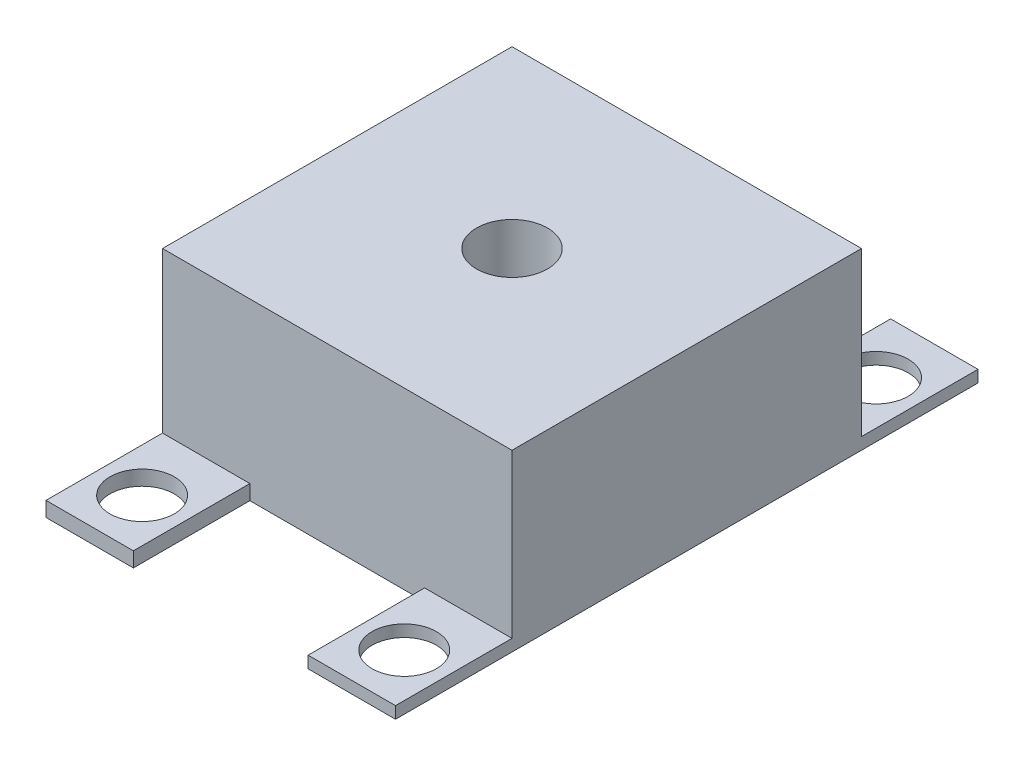
ISO-10303-21;
HEADER;
FILE_DESCRIPTION(('STEP AP214'),'2;1');
FILE_NAME('part.step','',(''),(''),'','','');
FILE_SCHEMA(('AUTOMOTIVE_DESIGN { 1 0 10303 214 1 1 1 1 }'));
ENDSEC;
DATA;
#1=APPLICATION_CONTEXT('core data for automotive mechanical design processes');
#2=APPLICATION_PROTOCOL_DEFINITION('international standard','automotive_design',2000,#1);
#3=PRODUCT_CONTEXT('',#1,'mechanical');
#4=PRODUCT('Part','Part','',(#3));
#5=PRODUCT_RELATED_PRODUCT_CATEGORY('part','',(#4));
#6=PRODUCT_DEFINITION_FORMATION('','',#4);
#7=PRODUCT_DEFINITION_CONTEXT('part definition',#1,'design');
#8=PRODUCT_DEFINITION('design','',#6,#7);
#9=PRODUCT_DEFINITION_SHAPE('','',#8);
#10=(LENGTH_UNIT() NAMED_UNIT(*) SI_UNIT(.MILLI.,.METRE.));
#11=(NAMED_UNIT(*) PLANE_ANGLE_UNIT() SI_UNIT($,.RADIAN.));
#12=(NAMED_UNIT(*) SI_UNIT($,.STERADIAN.) SOLID_ANGLE_UNIT());
#13=UNCERTAINTY_MEASURE_WITH_UNIT(LENGTH_MEASURE(1.E-05),#10,'distance_accuracy_value','');
#14=(GEOMETRIC_REPRESENTATION_CONTEXT(3) GLOBAL_UNCERTAINTY_ASSIGNED_CONTEXT((#13)) GLOBAL_UNIT_ASSIGNED_CONTEXT((#10,
#11,#12)) REPRESENTATION_CONTEXT('',''));
#15=CARTESIAN_POINT('',(0.,0.,0.));
#16=DIRECTION('',(0.,0.,1.));
#17=DIRECTION('',(1.,0.,0.));
#18=AXIS2_PLACEMENT_3D('',#15,#16,#17);
#19=CARTESIAN_POINT('',(15.,40.,-15.));
#20=DIRECTION('',(-1.,0.,0.));
#21=DIRECTION('',(0.,0.,1.));
#22=AXIS2_PLACEMENT_3D('',#19,#20,#21);
#23=PLANE('',#22);
#24=DIRECTION('',(0.,-1.,0.));
#25=VECTOR('',#24,1.);
#26=CARTESIAN_POINT('',(15.,40.,15.));
#27=LINE('',#26,#25);
#28=CARTESIAN_POINT('',(15.,40.,15.));
#29=VERTEX_POINT('',#28);
#30=CARTESIAN_POINT('',(15.,26.0178431332996,15.));
#31=VERTEX_POINT('',#30);
#32=EDGE_CURVE('E258',#29,#31,#27,.T.);
#33=ORIENTED_EDGE('',*,*,#32,.T.);
#34=DIRECTION('',(0.,0.,-1.));
#35=VECTOR('',#34,1.);
#36=CARTESIAN_POINT('',(15.,26.0178431332996,25.));
#37=LINE('',#36,#35);
#38=CARTESIAN_POINT('',(15.,26.0178431332996,25.));
#39=VERTEX_POINT('',#38);
#40=EDGE_CURVE('E226',#39,#31,#37,.T.);
#41=ORIENTED_EDGE('',*,*,#40,.F.);
#42=DIRECTION('',(0.,-1.,0.));
#43=VECTOR('',#42,1.);
#44=CARTESIAN_POINT('',(15.,25.,25.));
#45=LINE('',#44,#43);
#46=CARTESIAN_POINT('',(15.,25.,25.));
#47=VERTEX_POINT('',#46);
#48=EDGE_CURVE('E213',#39,#47,#45,.T.);
#49=ORIENTED_EDGE('',*,*,#48,.T.);
#50=DIRECTION('',(0.,0.,-1.));
#51=VECTOR('',#50,1.);
#52=CARTESIAN_POINT('',(15.,25.,-15.));
#53=LINE('',#52,#51);
#54=CARTESIAN_POINT('',(15.,25.,-25.));
#55=VERTEX_POINT('',#54);
#56=EDGE_CURVE('E259',#47,#55,#53,.T.);
#57=ORIENTED_EDGE('',*,*,#56,.T.);
#58=DIRECTION('',(0.,-1.,0.));
#59=VECTOR('',#58,1.);
#60=CARTESIAN_POINT('',(15.,25.,-25.));
#61=LINE('',#60,#59);
#62=CARTESIAN_POINT('',(15.,26.0178431332996,-25.));
#63=VERTEX_POINT('',#62);
#64=EDGE_CURVE('E201',#63,#55,#61,.T.);
#65=ORIENTED_EDGE('',*,*,#64,.F.);
#66=CARTESIAN_POINT('',(15.,26.0178431332996,-15.));
#67=VERTEX_POINT('',#66);
#68=EDGE_CURVE('E230',#67,#63,#37,.T.);
#69=ORIENTED_EDGE('',*,*,#68,.F.);
#70=DIRECTION('',(0.,-1.,0.));
#71=VECTOR('',#70,1.);
#72=CARTESIAN_POINT('',(15.,40.,-15.));
#73=LINE('',#72,#71);
#74=CARTESIAN_POINT('',(15.,40.,-15.));
#75=VERTEX_POINT('',#74);
#76=EDGE_CURVE('E273',#75,#67,#73,.T.);
#77=ORIENTED_EDGE('',*,*,#76,.F.);
#78=DIRECTION('',(0.,0.,-1.));
#79=VECTOR('',#78,1.);
#80=CARTESIAN_POINT('',(15.,40.,-15.));
#81=LINE('',#80,#79);
#82=EDGE_CURVE('E248',#29,#75,#81,.T.);
#83=ORIENTED_EDGE('',*,*,#82,.F.);
#84=EDGE_LOOP('',(#33,#41,#49,#57,#65,#69,#77,#83));
#85=FACE_BOUND('',#84,.T.);
#86=ADVANCED_FACE('F33',(#85),#23,.F.);
#87=CARTESIAN_POINT('',(-15.,40.,-15.));
#88=DIRECTION('',(0.,0.,1.));
#89=DIRECTION('',(1.,0.,0.));
#90=AXIS2_PLACEMENT_3D('',#87,#88,#89);
#91=PLANE('',#90);
#92=DIRECTION('',(-1.,0.,0.));
#93=VECTOR('',#92,1.);
#94=CARTESIAN_POINT('',(-15.,25.,-15.));
#95=LINE('',#94,#93);
#96=CARTESIAN_POINT('',(7.5,25.,-15.));
#97=VERTEX_POINT('',#96);
#98=CARTESIAN_POINT('',(-7.5,25.,-15.));
#99=VERTEX_POINT('',#98);
#100=EDGE_CURVE('E261',#97,#99,#95,.T.);
#101=ORIENTED_EDGE('',*,*,#100,.T.);
#102=DIRECTION('',(0.,1.,0.));
#103=VECTOR('',#102,1.);
#104=CARTESIAN_POINT('',(-7.5,40.,-15.));
#105=LINE('',#104,#103);
#106=CARTESIAN_POINT('',(-7.5,26.2761833000056,-15.));
#107=VERTEX_POINT('',#106);
#108=EDGE_CURVE('E196',#99,#107,#105,.T.);
#109=ORIENTED_EDGE('',*,*,#108,.T.);
#110=DIRECTION('',(-1.,0.,0.));
#111=VECTOR('',#110,1.);
#112=CARTESIAN_POINT('',(-15.,26.2761833000056,-15.));
#113=LINE('',#112,#111);
#114=CARTESIAN_POINT('',(-15.,26.2761833000056,-15.));
#115=VERTEX_POINT('',#114);
#116=EDGE_CURVE('E199',#107,#115,#113,.T.);
#117=ORIENTED_EDGE('',*,*,#116,.T.);
#118=DIRECTION('',(0.,-1.,0.));
#119=VECTOR('',#118,1.);
#120=CARTESIAN_POINT('',(-15.,40.,-15.));
#121=LINE('',#120,#119);
#122=CARTESIAN_POINT('',(-15.,40.,-15.));
#123=VERTEX_POINT('',#122);
#124=EDGE_CURVE('E152',#123,#115,#121,.T.);
#125=ORIENTED_EDGE('',*,*,#124,.F.);
#126=DIRECTION('',(-1.,0.,0.));
#127=VECTOR('',#126,1.);
#128=CARTESIAN_POINT('',(-15.,40.,-15.));
#129=LINE('',#128,#127);
#130=EDGE_CURVE('E251',#75,#123,#129,.T.);
#131=ORIENTED_EDGE('',*,*,#130,.F.);
#132=ORIENTED_EDGE('',*,*,#76,.T.);
#133=DIRECTION('',(-1.,0.,0.));
#134=VECTOR('',#133,1.);
#135=CARTESIAN_POINT('',(-15.,26.0178431332996,-15.));
#136=LINE('',#135,#134);
#137=CARTESIAN_POINT('',(7.5,26.0178431332996,-15.));
#138=VERTEX_POINT('',#137);
#139=EDGE_CURVE('E242',#67,#138,#136,.T.);
#140=ORIENTED_EDGE('',*,*,#139,.T.);
#141=DIRECTION('',(0.,-1.,0.));
#142=VECTOR('',#141,1.);
#143=CARTESIAN_POINT('',(7.5,40.,-15.));
#144=LINE('',#143,#142);
#145=EDGE_CURVE('E239',#138,#97,#144,.T.);
#146=ORIENTED_EDGE('',*,*,#145,.T.);
#147=EDGE_LOOP('',(#101,#109,#117,#125,#131,#132,#140,#146));
#148=FACE_BOUND('',#147,.T.);
#149=ADVANCED_FACE('F319',(#148),#91,.F.);
#150=CARTESIAN_POINT('',(-15.,40.,-15.));
#151=DIRECTION('',(1.,0.,0.));
#152=DIRECTION('',(0.,0.,-1.));
#153=AXIS2_PLACEMENT_3D('',#150,#151,#152);
#154=PLANE('',#153);
#155=ORIENTED_EDGE('',*,*,#124,.T.);
#156=DIRECTION('',(0.,0.,-1.));
#157=VECTOR('',#156,1.);
#158=CARTESIAN_POINT('',(-15.,26.2761833000056,25.));
#159=LINE('',#158,#157);
#160=CARTESIAN_POINT('',(-15.,26.2761833000056,-25.));
#161=VERTEX_POINT('',#160);
#162=EDGE_CURVE('E49',#115,#161,#159,.T.);
#163=ORIENTED_EDGE('',*,*,#162,.T.);
#164=DIRECTION('',(0.,1.,0.));
#165=VECTOR('',#164,1.);
#166=CARTESIAN_POINT('',(-15.,25.,-25.));
#167=LINE('',#166,#165);
#168=CARTESIAN_POINT('',(-15.,25.,-25.));
#169=VERTEX_POINT('',#168);
#170=EDGE_CURVE('E149',#169,#161,#167,.T.);
#171=ORIENTED_EDGE('',*,*,#170,.F.);
#172=DIRECTION('',(0.,0.,1.));
#173=VECTOR('',#172,1.);
#174=CARTESIAN_POINT('',(-15.,25.,-15.));
#175=LINE('',#174,#173);
#176=CARTESIAN_POINT('',(-15.,25.,25.));
#177=VERTEX_POINT('',#176);
#178=EDGE_CURVE('E264',#169,#177,#175,.T.);
#179=ORIENTED_EDGE('',*,*,#178,.T.);
#180=DIRECTION('',(0.,1.,0.));
#181=VECTOR('',#180,1.);
#182=CARTESIAN_POINT('',(-15.,25.,25.));
#183=LINE('',#182,#181);
#184=CARTESIAN_POINT('',(-15.,26.2761833000056,25.));
#185=VERTEX_POINT('',#184);
#186=EDGE_CURVE('E178',#177,#185,#183,.T.);
#187=ORIENTED_EDGE('',*,*,#186,.T.);
#188=CARTESIAN_POINT('',(-15.,26.2761833000056,15.));
#189=VERTEX_POINT('',#188);
#190=EDGE_CURVE('E153',#185,#189,#159,.T.);
#191=ORIENTED_EDGE('',*,*,#190,.T.);
#192=DIRECTION('',(0.,-1.,0.));
#193=VECTOR('',#192,1.);
#194=CARTESIAN_POINT('',(-15.,40.,15.));
#195=LINE('',#194,#193);
#196=CARTESIAN_POINT('',(-15.,40.,15.));
#197=VERTEX_POINT('',#196);
#198=EDGE_CURVE('E269',#197,#189,#195,.T.);
#199=ORIENTED_EDGE('',*,*,#198,.F.);
#200=DIRECTION('',(0.,0.,1.));
#201=VECTOR('',#200,1.);
#202=CARTESIAN_POINT('',(-15.,40.,-15.));
#203=LINE('',#202,#201);
#204=EDGE_CURVE('E254',#123,#197,#203,.T.);
#205=ORIENTED_EDGE('',*,*,#204,.F.);
#206=EDGE_LOOP('',(#155,#163,#171,#179,#187,#191,#199,#205));
#207=FACE_BOUND('',#206,.T.);
#208=ADVANCED_FACE('F147',(#207),#154,.F.);
#209=CARTESIAN_POINT('',(-15.,40.,15.));
#210=DIRECTION('',(0.,0.,-1.));
#211=DIRECTION('',(-1.,0.,0.));
#212=AXIS2_PLACEMENT_3D('',#209,#210,#211);
#213=PLANE('',#212);
#214=DIRECTION('',(1.,0.,0.));
#215=VECTOR('',#214,1.);
#216=CARTESIAN_POINT('',(-15.,26.2761833000056,15.));
#217=LINE('',#216,#215);
#218=CARTESIAN_POINT('',(-7.5,26.2761833000056,15.));
#219=VERTEX_POINT('',#218);
#220=EDGE_CURVE('E11',#189,#219,#217,.T.);
#221=ORIENTED_EDGE('',*,*,#220,.T.);
#222=DIRECTION('',(0.,-1.,0.));
#223=VECTOR('',#222,1.);
#224=CARTESIAN_POINT('',(-7.5,40.,15.));
#225=LINE('',#224,#223);
#226=CARTESIAN_POINT('',(-7.5,25.,15.));
#227=VERTEX_POINT('',#226);
#228=EDGE_CURVE('E190',#219,#227,#225,.T.);
#229=ORIENTED_EDGE('',*,*,#228,.T.);
#230=DIRECTION('',(1.,0.,0.));
#231=VECTOR('',#230,1.);
#232=CARTESIAN_POINT('',(-15.,25.,15.));
#233=LINE('',#232,#231);
#234=CARTESIAN_POINT('',(7.5,25.,15.));
#235=VERTEX_POINT('',#234);
#236=EDGE_CURVE('E252',#227,#235,#233,.T.);
#237=ORIENTED_EDGE('',*,*,#236,.T.);
#238=DIRECTION('',(0.,1.,0.));
#239=VECTOR('',#238,1.);
#240=CARTESIAN_POINT('',(7.5,40.,15.));
#241=LINE('',#240,#239);
#242=CARTESIAN_POINT('',(7.5,26.0178431332996,15.));
#243=VERTEX_POINT('',#242);
#244=EDGE_CURVE('E229',#235,#243,#241,.T.);
#245=ORIENTED_EDGE('',*,*,#244,.T.);
#246=DIRECTION('',(1.,0.,0.));
#247=VECTOR('',#246,1.);
#248=CARTESIAN_POINT('',(-15.,26.0178431332996,15.));
#249=LINE('',#248,#247);
#250=EDGE_CURVE('E41',#243,#31,#249,.T.);
#251=ORIENTED_EDGE('',*,*,#250,.T.);
#252=ORIENTED_EDGE('',*,*,#32,.F.);
#253=DIRECTION('',(1.,0.,0.));
#254=VECTOR('',#253,1.);
#255=CARTESIAN_POINT('',(-15.,40.,15.));
#256=LINE('',#255,#254);
#257=EDGE_CURVE('E256',#197,#29,#256,.T.);
#258=ORIENTED_EDGE('',*,*,#257,.F.);
#259=ORIENTED_EDGE('',*,*,#198,.T.);
#260=EDGE_LOOP('',(#221,#229,#237,#245,#251,#252,#258,#259));
#261=FACE_BOUND('',#260,.T.);
#262=ADVANCED_FACE('F312',(#261),#213,.F.);
#263=CARTESIAN_POINT('',(0.,40.,0.));
#264=DIRECTION('',(0.,1.,0.));
#265=DIRECTION('',(0.,0.,1.));
#266=AXIS2_PLACEMENT_3D('',#263,#264,#265);
#267=PLANE('',#266);
#268=CARTESIAN_POINT('',(0.,40.,0.));
#269=DIRECTION('',(0.,1.,0.));
#270=DIRECTION('',(0.,0.,1.));
#271=AXIS2_PLACEMENT_3D('',#268,#269,#270);
#272=CIRCLE('',#271,3.05);
#273=CARTESIAN_POINT('',(0.,40.,3.05));
#274=VERTEX_POINT('',#273);
#275=EDGE_CURVE('E244',#274,#274,#272,.T.);
#276=ORIENTED_EDGE('',*,*,#275,.F.);
#277=EDGE_LOOP('',(#276));
#278=FACE_BOUND('',#277,.T.);
#279=ORIENTED_EDGE('',*,*,#82,.T.);
#280=ORIENTED_EDGE('',*,*,#130,.T.);
#281=ORIENTED_EDGE('',*,*,#204,.T.);
#282=ORIENTED_EDGE('',*,*,#257,.T.);
#283=EDGE_LOOP('',(#279,#280,#281,#282));
#284=FACE_BOUND('',#283,.T.);
#285=ADVANCED_FACE('F316',(#278,#284),#267,.T.);
#286=CARTESIAN_POINT('',(0.,25.,0.));
#287=DIRECTION('',(0.,1.,0.));
#288=DIRECTION('',(0.,0.,1.));
#289=AXIS2_PLACEMENT_3D('',#286,#287,#288);
#290=PLANE('',#289);
#291=CARTESIAN_POINT('',(11.25,25.,-20.));
#292=DIRECTION('',(0.,1.,0.));
#293=DIRECTION('',(0.,0.,1.));
#294=AXIS2_PLACEMENT_3D('',#291,#292,#293);
#295=CIRCLE('',#294,2.76);
#296=CARTESIAN_POINT('',(11.25,25.,-17.24));
#297=VERTEX_POINT('',#296);
#298=EDGE_CURVE('E279',#297,#297,#295,.T.);
#299=ORIENTED_EDGE('',*,*,#298,.T.);
#300=EDGE_LOOP('',(#299));
#301=FACE_BOUND('',#300,.T.);
#302=CARTESIAN_POINT('',(-11.2499999999996,25.,20.5));
#303=DIRECTION('',(0.,1.,0.));
#304=DIRECTION('',(0.,0.,1.));
#305=AXIS2_PLACEMENT_3D('',#302,#303,#304);
#306=CIRCLE('',#305,2.76);
#307=CARTESIAN_POINT('',(-11.2499999999996,25.,23.26));
#308=VERTEX_POINT('',#307);
#309=EDGE_CURVE('E280',#308,#308,#306,.T.);
#310=ORIENTED_EDGE('',*,*,#309,.T.);
#311=EDGE_LOOP('',(#310));
#312=FACE_BOUND('',#311,.T.);
#313=CARTESIAN_POINT('',(11.2500000000004,25.,20.5));
#314=DIRECTION('',(0.,1.,0.));
#315=DIRECTION('',(0.,0.,1.));
#316=AXIS2_PLACEMENT_3D('',#313,#314,#315);
#317=CIRCLE('',#316,2.76);
#318=CARTESIAN_POINT('',(11.2500000000004,25.,23.26));
#319=VERTEX_POINT('',#318);
#320=EDGE_CURVE('E170',#319,#319,#317,.T.);
#321=ORIENTED_EDGE('',*,*,#320,.T.);
#322=EDGE_LOOP('',(#321));
#323=FACE_BOUND('',#322,.T.);
#324=CARTESIAN_POINT('',(-11.25,25.,-20.));
#325=DIRECTION('',(0.,1.,0.));
#326=DIRECTION('',(0.,0.,1.));
#327=AXIS2_PLACEMENT_3D('',#324,#325,#326);
#328=CIRCLE('',#327,2.76);
#329=CARTESIAN_POINT('',(-11.25,25.,-17.24));
#330=VERTEX_POINT('',#329);
#331=EDGE_CURVE('E285',#330,#330,#328,.T.);
#332=ORIENTED_EDGE('',*,*,#331,.T.);
#333=EDGE_LOOP('',(#332));
#334=FACE_BOUND('',#333,.T.);
#335=CARTESIAN_POINT('',(0.,25.,0.));
#336=DIRECTION('',(0.,1.,0.));
#337=DIRECTION('',(0.,0.,1.));
#338=AXIS2_PLACEMENT_3D('',#335,#336,#337);
#339=CIRCLE('',#338,3.05);
#340=CARTESIAN_POINT('',(0.,25.,3.05));
#341=VERTEX_POINT('',#340);
#342=EDGE_CURVE('E247',#341,#341,#339,.T.);
#343=ORIENTED_EDGE('',*,*,#342,.T.);
#344=EDGE_LOOP('',(#343));
#345=FACE_BOUND('',#344,.T.);
#346=ORIENTED_EDGE('',*,*,#236,.F.);
#347=DIRECTION('',(0.,0.,-1.));
#348=VECTOR('',#347,1.);
#349=CARTESIAN_POINT('',(-7.5,25.,25.));
#350=LINE('',#349,#348);
#351=CARTESIAN_POINT('',(-7.5,25.,25.));
#352=VERTEX_POINT('',#351);
#353=EDGE_CURVE('E188',#352,#227,#350,.T.);
#354=ORIENTED_EDGE('',*,*,#353,.F.);
#355=DIRECTION('',(-1.,0.,0.));
#356=VECTOR('',#355,1.);
#357=CARTESIAN_POINT('',(-15.,25.,25.));
#358=LINE('',#357,#356);
#359=EDGE_CURVE('E154',#352,#177,#358,.T.);
#360=ORIENTED_EDGE('',*,*,#359,.T.);
#361=ORIENTED_EDGE('',*,*,#178,.F.);
#362=DIRECTION('',(-1.,0.,0.));
#363=VECTOR('',#362,1.);
#364=CARTESIAN_POINT('',(-15.,25.,-25.));
#365=LINE('',#364,#363);
#366=CARTESIAN_POINT('',(-7.5,25.,-25.));
#367=VERTEX_POINT('',#366);
#368=EDGE_CURVE('E169',#367,#169,#365,.T.);
#369=ORIENTED_EDGE('',*,*,#368,.F.);
#370=EDGE_CURVE('E191',#99,#367,#350,.T.);
#371=ORIENTED_EDGE('',*,*,#370,.F.);
#372=ORIENTED_EDGE('',*,*,#100,.F.);
#373=DIRECTION('',(0.,0.,-1.));
#374=VECTOR('',#373,1.);
#375=CARTESIAN_POINT('',(7.5,25.,25.));
#376=LINE('',#375,#374);
#377=CARTESIAN_POINT('',(7.5,25.,-25.));
#378=VERTEX_POINT('',#377);
#379=EDGE_CURVE('E225',#97,#378,#376,.T.);
#380=ORIENTED_EDGE('',*,*,#379,.T.);
#381=DIRECTION('',(-1.,0.,0.));
#382=VECTOR('',#381,1.);
#383=CARTESIAN_POINT('',(15.,25.,-25.));
#384=LINE('',#383,#382);
#385=EDGE_CURVE('E204',#55,#378,#384,.T.);
#386=ORIENTED_EDGE('',*,*,#385,.F.);
#387=ORIENTED_EDGE('',*,*,#56,.F.);
#388=DIRECTION('',(-1.,0.,0.));
#389=VECTOR('',#388,1.);
#390=CARTESIAN_POINT('',(15.,25.,25.));
#391=LINE('',#390,#389);
#392=CARTESIAN_POINT('',(7.5,25.,25.));
#393=VERTEX_POINT('',#392);
#394=EDGE_CURVE('E216',#47,#393,#391,.T.);
#395=ORIENTED_EDGE('',*,*,#394,.T.);
#396=EDGE_CURVE('E235',#393,#235,#376,.T.);
#397=ORIENTED_EDGE('',*,*,#396,.T.);
#398=EDGE_LOOP('',(#346,#354,#360,#361,#369,#371,#372,#380,#386,#387,#395,#397));
#399=FACE_BOUND('',#398,.T.);
#400=ADVANCED_FACE('F325',(#301,#312,#323,#334,#345,#399),#290,.F.);
#401=CARTESIAN_POINT('',(0.,-8.62670273047587,0.));
#402=DIRECTION('',(0.,1.,0.));
#403=DIRECTION('',(0.,0.,1.));
#404=AXIS2_PLACEMENT_3D('',#401,#402,#403);
#405=CYLINDRICAL_SURFACE('',#404,3.05);
#406=ORIENTED_EDGE('',*,*,#275,.T.);
#407=EDGE_LOOP('',(#406));
#408=FACE_BOUND('',#407,.T.);
#409=ORIENTED_EDGE('',*,*,#342,.F.);
#410=EDGE_LOOP('',(#409));
#411=FACE_BOUND('',#410,.T.);
#412=ADVANCED_FACE('F382',(#408,#411),#405,.F.);
#413=CARTESIAN_POINT('',(0.,0.,25.));
#414=DIRECTION('',(0.,0.,1.));
#415=DIRECTION('',(1.,0.,0.));
#416=AXIS2_PLACEMENT_3D('',#413,#414,#415);
#417=PLANE('',#416);
#418=ORIENTED_EDGE('',*,*,#48,.F.);
#419=DIRECTION('',(1.,0.,0.));
#420=VECTOR('',#419,1.);
#421=CARTESIAN_POINT('',(15.,26.0178431332996,25.));
#422=LINE('',#421,#420);
#423=CARTESIAN_POINT('',(7.5,26.0178431332996,25.));
#424=VERTEX_POINT('',#423);
#425=EDGE_CURVE('E222',#424,#39,#422,.T.);
#426=ORIENTED_EDGE('',*,*,#425,.F.);
#427=DIRECTION('',(0.,1.,0.));
#428=VECTOR('',#427,1.);
#429=CARTESIAN_POINT('',(7.5,25.,25.));
#430=LINE('',#429,#428);
#431=EDGE_CURVE('E219',#393,#424,#430,.T.);
#432=ORIENTED_EDGE('',*,*,#431,.F.);
#433=ORIENTED_EDGE('',*,*,#394,.F.);
#434=EDGE_LOOP('',(#418,#426,#432,#433));
#435=FACE_BOUND('',#434,.T.);
#436=ADVANCED_FACE('F338',(#435),#417,.T.);
#437=CARTESIAN_POINT('',(7.5,25.,25.));
#438=DIRECTION('',(-1.,0.,0.));
#439=DIRECTION('',(0.,0.,1.));
#440=AXIS2_PLACEMENT_3D('',#437,#438,#439);
#441=PLANE('',#440);
#442=ORIENTED_EDGE('',*,*,#244,.F.);
#443=ORIENTED_EDGE('',*,*,#396,.F.);
#444=ORIENTED_EDGE('',*,*,#431,.T.);
#445=DIRECTION('',(0.,0.,-1.));
#446=VECTOR('',#445,1.);
#447=CARTESIAN_POINT('',(7.5,26.0178431332996,25.));
#448=LINE('',#447,#446);
#449=EDGE_CURVE('E231',#424,#243,#448,.T.);
#450=ORIENTED_EDGE('',*,*,#449,.T.);
#451=EDGE_LOOP('',(#442,#443,#444,#450));
#452=FACE_BOUND('',#451,.T.);
#453=ADVANCED_FACE('F334',(#452),#441,.T.);
#454=CARTESIAN_POINT('',(15.,26.0178431332996,25.));
#455=DIRECTION('',(0.,1.,0.));
#456=DIRECTION('',(0.,0.,1.));
#457=AXIS2_PLACEMENT_3D('',#454,#455,#456);
#458=PLANE('',#457);
#459=CARTESIAN_POINT('',(11.2500000000004,26.0178431332996,20.5));
#460=DIRECTION('',(0.,1.,0.));
#461=DIRECTION('',(0.,0.,1.));
#462=AXIS2_PLACEMENT_3D('',#459,#460,#461);
#463=CIRCLE('',#462,2.76);
#464=CARTESIAN_POINT('',(11.2500000000004,26.0178431332996,23.26));
#465=VERTEX_POINT('',#464);
#466=EDGE_CURVE('E36',#465,#465,#463,.T.);
#467=ORIENTED_EDGE('',*,*,#466,.F.);
#468=EDGE_LOOP('',(#467));
#469=FACE_BOUND('',#468,.T.);
#470=ORIENTED_EDGE('',*,*,#250,.F.);
#471=ORIENTED_EDGE('',*,*,#449,.F.);
#472=ORIENTED_EDGE('',*,*,#425,.T.);
#473=ORIENTED_EDGE('',*,*,#40,.T.);
#474=EDGE_LOOP('',(#470,#471,#472,#473));
#475=FACE_BOUND('',#474,.T.);
#476=ADVANCED_FACE('F341',(#469,#475),#458,.T.);
#477=CARTESIAN_POINT('',(11.25,26.0178431332996,-20.));
#478=DIRECTION('',(0.,1.,0.));
#479=DIRECTION('',(0.,0.,1.));
#480=AXIS2_PLACEMENT_3D('',#477,#478,#479);
#481=CIRCLE('',#480,2.76);
#482=CARTESIAN_POINT('',(11.25,26.0178431332996,-17.24));
#483=VERTEX_POINT('',#482);
#484=EDGE_CURVE('E277',#483,#483,#481,.T.);
#485=ORIENTED_EDGE('',*,*,#484,.F.);
#486=EDGE_LOOP('',(#485));
#487=FACE_BOUND('',#486,.T.);
#488=ORIENTED_EDGE('',*,*,#139,.F.);
#489=ORIENTED_EDGE('',*,*,#68,.T.);
#490=DIRECTION('',(1.,0.,0.));
#491=VECTOR('',#490,1.);
#492=CARTESIAN_POINT('',(15.,26.0178431332996,-25.));
#493=LINE('',#492,#491);
#494=CARTESIAN_POINT('',(7.5,26.0178431332996,-25.));
#495=VERTEX_POINT('',#494);
#496=EDGE_CURVE('E210',#495,#63,#493,.T.);
#497=ORIENTED_EDGE('',*,*,#496,.F.);
#498=EDGE_CURVE('E234',#138,#495,#448,.T.);
#499=ORIENTED_EDGE('',*,*,#498,.F.);
#500=EDGE_LOOP('',(#488,#489,#497,#499));
#501=FACE_BOUND('',#500,.T.);
#502=ADVANCED_FACE('F349',(#487,#501),#458,.T.);
#503=ORIENTED_EDGE('',*,*,#145,.F.);
#504=ORIENTED_EDGE('',*,*,#498,.T.);
#505=DIRECTION('',(0.,1.,0.));
#506=VECTOR('',#505,1.);
#507=CARTESIAN_POINT('',(7.5,25.,-25.));
#508=LINE('',#507,#506);
#509=EDGE_CURVE('E207',#378,#495,#508,.T.);
#510=ORIENTED_EDGE('',*,*,#509,.F.);
#511=ORIENTED_EDGE('',*,*,#379,.F.);
#512=EDGE_LOOP('',(#503,#504,#510,#511));
#513=FACE_BOUND('',#512,.T.);
#514=ADVANCED_FACE('F353',(#513),#441,.T.);
#515=CARTESIAN_POINT('',(0.,0.,-25.));
#516=DIRECTION('',(0.,0.,1.));
#517=DIRECTION('',(1.,0.,0.));
#518=AXIS2_PLACEMENT_3D('',#515,#516,#517);
#519=PLANE('',#518);
#520=ORIENTED_EDGE('',*,*,#64,.T.);
#521=ORIENTED_EDGE('',*,*,#385,.T.);
#522=ORIENTED_EDGE('',*,*,#509,.T.);
#523=ORIENTED_EDGE('',*,*,#496,.T.);
#524=EDGE_LOOP('',(#520,#521,#522,#523));
#525=FACE_BOUND('',#524,.T.);
#526=ADVANCED_FACE('F356',(#525),#519,.F.);
#527=CARTESIAN_POINT('',(0.,0.,25.));
#528=DIRECTION('',(0.,0.,-1.));
#529=DIRECTION('',(-1.,0.,0.));
#530=AXIS2_PLACEMENT_3D('',#527,#528,#529);
#531=PLANE('',#530);
#532=ORIENTED_EDGE('',*,*,#186,.F.);
#533=ORIENTED_EDGE('',*,*,#359,.F.);
#534=DIRECTION('',(0.,-1.,0.));
#535=VECTOR('',#534,1.);
#536=CARTESIAN_POINT('',(-7.5,25.,25.));
#537=LINE('',#536,#535);
#538=CARTESIAN_POINT('',(-7.5,26.2761833000056,25.));
#539=VERTEX_POINT('',#538);
#540=EDGE_CURVE('E183',#539,#352,#537,.T.);
#541=ORIENTED_EDGE('',*,*,#540,.F.);
#542=DIRECTION('',(1.,0.,0.));
#543=VECTOR('',#542,1.);
#544=CARTESIAN_POINT('',(-15.,26.2761833000056,25.));
#545=LINE('',#544,#543);
#546=EDGE_CURVE('E181',#185,#539,#545,.T.);
#547=ORIENTED_EDGE('',*,*,#546,.F.);
#548=EDGE_LOOP('',(#532,#533,#541,#547));
#549=FACE_BOUND('',#548,.T.);
#550=ADVANCED_FACE('F305',(#549),#531,.F.);
#551=CARTESIAN_POINT('',(-15.,26.2761833000056,25.));
#552=DIRECTION('',(0.,1.,0.));
#553=DIRECTION('',(0.,0.,1.));
#554=AXIS2_PLACEMENT_3D('',#551,#552,#553);
#555=PLANE('',#554);
#556=CARTESIAN_POINT('',(-11.2499999999996,26.2761833000056,20.5));
#557=DIRECTION('',(0.,1.,0.));
#558=DIRECTION('',(0.,0.,1.));
#559=AXIS2_PLACEMENT_3D('',#556,#557,#558);
#560=CIRCLE('',#559,2.76);
#561=CARTESIAN_POINT('',(-11.2499999999996,26.2761833000056,23.26));
#562=VERTEX_POINT('',#561);
#563=EDGE_CURVE('E295',#562,#562,#560,.T.);
#564=ORIENTED_EDGE('',*,*,#563,.F.);
#565=EDGE_LOOP('',(#564));
#566=FACE_BOUND('',#565,.T.);
#567=ORIENTED_EDGE('',*,*,#220,.F.);
#568=ORIENTED_EDGE('',*,*,#190,.F.);
#569=ORIENTED_EDGE('',*,*,#546,.T.);
#570=DIRECTION('',(0.,0.,-1.));
#571=VECTOR('',#570,1.);
#572=CARTESIAN_POINT('',(-7.5,26.2761833000056,25.));
#573=LINE('',#572,#571);
#574=EDGE_CURVE('E57',#539,#219,#573,.T.);
#575=ORIENTED_EDGE('',*,*,#574,.T.);
#576=EDGE_LOOP('',(#567,#568,#569,#575));
#577=FACE_BOUND('',#576,.T.);
#578=ADVANCED_FACE('F302',(#566,#577),#555,.T.);
#579=CARTESIAN_POINT('',(-7.5,25.,25.));
#580=DIRECTION('',(1.,0.,0.));
#581=DIRECTION('',(0.,0.,-1.));
#582=AXIS2_PLACEMENT_3D('',#579,#580,#581);
#583=PLANE('',#582);
#584=ORIENTED_EDGE('',*,*,#228,.F.);
#585=ORIENTED_EDGE('',*,*,#574,.F.);
#586=ORIENTED_EDGE('',*,*,#540,.T.);
#587=ORIENTED_EDGE('',*,*,#353,.T.);
#588=EDGE_LOOP('',(#584,#585,#586,#587));
#589=FACE_BOUND('',#588,.T.);
#590=ADVANCED_FACE('F304',(#589),#583,.T.);
#591=CARTESIAN_POINT('',(-11.25,26.2761833000056,-20.));
#592=DIRECTION('',(0.,1.,0.));
#593=DIRECTION('',(0.,0.,1.));
#594=AXIS2_PLACEMENT_3D('',#591,#592,#593);
#595=CIRCLE('',#594,2.76);
#596=CARTESIAN_POINT('',(-11.25,26.2761833000056,-17.24));
#597=VERTEX_POINT('',#596);
#598=EDGE_CURVE('E290',#597,#597,#595,.T.);
#599=ORIENTED_EDGE('',*,*,#598,.F.);
#600=EDGE_LOOP('',(#599));
#601=FACE_BOUND('',#600,.T.);
#602=ORIENTED_EDGE('',*,*,#116,.F.);
#603=CARTESIAN_POINT('',(-7.5,26.2761833000056,-25.));
#604=VERTEX_POINT('',#603);
#605=EDGE_CURVE('E160',#107,#604,#573,.T.);
#606=ORIENTED_EDGE('',*,*,#605,.T.);
#607=DIRECTION('',(1.,0.,0.));
#608=VECTOR('',#607,1.);
#609=CARTESIAN_POINT('',(-15.,26.2761833000056,-25.));
#610=LINE('',#609,#608);
#611=EDGE_CURVE('E157',#161,#604,#610,.T.);
#612=ORIENTED_EDGE('',*,*,#611,.F.);
#613=ORIENTED_EDGE('',*,*,#162,.F.);
#614=EDGE_LOOP('',(#602,#606,#612,#613));
#615=FACE_BOUND('',#614,.T.);
#616=ADVANCED_FACE('F158',(#601,#615),#555,.T.);
#617=ORIENTED_EDGE('',*,*,#108,.F.);
#618=ORIENTED_EDGE('',*,*,#370,.T.);
#619=DIRECTION('',(0.,-1.,0.));
#620=VECTOR('',#619,1.);
#621=CARTESIAN_POINT('',(-7.5,25.,-25.));
#622=LINE('',#621,#620);
#623=EDGE_CURVE('E164',#604,#367,#622,.T.);
#624=ORIENTED_EDGE('',*,*,#623,.F.);
#625=ORIENTED_EDGE('',*,*,#605,.F.);
#626=EDGE_LOOP('',(#617,#618,#624,#625));
#627=FACE_BOUND('',#626,.T.);
#628=ADVANCED_FACE('F321',(#627),#583,.T.);
#629=CARTESIAN_POINT('',(0.,0.,-25.));
#630=DIRECTION('',(0.,0.,-1.));
#631=DIRECTION('',(-1.,0.,0.));
#632=AXIS2_PLACEMENT_3D('',#629,#630,#631);
#633=PLANE('',#632);
#634=ORIENTED_EDGE('',*,*,#170,.T.);
#635=ORIENTED_EDGE('',*,*,#611,.T.);
#636=ORIENTED_EDGE('',*,*,#623,.T.);
#637=ORIENTED_EDGE('',*,*,#368,.T.);
#638=EDGE_LOOP('',(#634,#635,#636,#637));
#639=FACE_BOUND('',#638,.T.);
#640=ADVANCED_FACE('F167',(#639),#633,.T.);
#641=CARTESIAN_POINT('',(-11.25,16.2761833000056,-20.));
#642=DIRECTION('',(0.,1.,0.));
#643=DIRECTION('',(0.,0.,1.));
#644=AXIS2_PLACEMENT_3D('',#641,#642,#643);
#645=CYLINDRICAL_SURFACE('',#644,2.76);
#646=ORIENTED_EDGE('',*,*,#598,.T.);
#647=EDGE_LOOP('',(#646));
#648=FACE_BOUND('',#647,.T.);
#649=ORIENTED_EDGE('',*,*,#331,.F.);
#650=EDGE_LOOP('',(#649));
#651=FACE_BOUND('',#650,.T.);
#652=ADVANCED_FACE('F417',(#648,#651),#645,.F.);
#653=CARTESIAN_POINT('',(-11.2499999999996,16.2761833000056,20.5));
#654=DIRECTION('',(0.,1.,0.));
#655=DIRECTION('',(0.,0.,1.));
#656=AXIS2_PLACEMENT_3D('',#653,#654,#655);
#657=CYLINDRICAL_SURFACE('',#656,2.76);
#658=ORIENTED_EDGE('',*,*,#563,.T.);
#659=EDGE_LOOP('',(#658));
#660=FACE_BOUND('',#659,.T.);
#661=ORIENTED_EDGE('',*,*,#309,.F.);
#662=EDGE_LOOP('',(#661));
#663=FACE_BOUND('',#662,.T.);
#664=ADVANCED_FACE('F299',(#660,#663),#657,.F.);
#665=CARTESIAN_POINT('',(11.25,16.2761833000056,-20.));
#666=DIRECTION('',(0.,1.,0.));
#667=DIRECTION('',(0.,0.,1.));
#668=AXIS2_PLACEMENT_3D('',#665,#666,#667);
#669=CYLINDRICAL_SURFACE('',#668,2.76);
#670=ORIENTED_EDGE('',*,*,#484,.T.);
#671=EDGE_LOOP('',(#670));
#672=FACE_BOUND('',#671,.T.);
#673=ORIENTED_EDGE('',*,*,#298,.F.);
#674=EDGE_LOOP('',(#673));
#675=FACE_BOUND('',#674,.T.);
#676=ADVANCED_FACE('F407',(#672,#675),#669,.F.);
#677=CARTESIAN_POINT('',(11.2500000000004,16.2761833000056,20.5));
#678=DIRECTION('',(0.,1.,0.));
#679=DIRECTION('',(0.,0.,1.));
#680=AXIS2_PLACEMENT_3D('',#677,#678,#679);
#681=CYLINDRICAL_SURFACE('',#680,2.76);
#682=ORIENTED_EDGE('',*,*,#466,.T.);
#683=EDGE_LOOP('',(#682));
#684=FACE_BOUND('',#683,.T.);
#685=ORIENTED_EDGE('',*,*,#320,.F.);
#686=EDGE_LOOP('',(#685));
#687=FACE_BOUND('',#686,.T.);
#688=ADVANCED_FACE('F404',(#684,#687),#681,.F.);
#689=CLOSED_SHELL('',(#86,#149,#208,#262,#285,#400,#412,#436,#453,#476,#502,#514,#526,#550,#578,
#590,#616,#628,#640,#652,#664,#676,#688));
#690=MANIFOLD_SOLID_BREP('B2',#689);
#691=ADVANCED_BREP_SHAPE_REPRESENTATION('',(#18,#690),#14);
#692=SHAPE_DEFINITION_REPRESENTATION(#9,#691);
ENDSEC;
END-ISO-10303-21;
